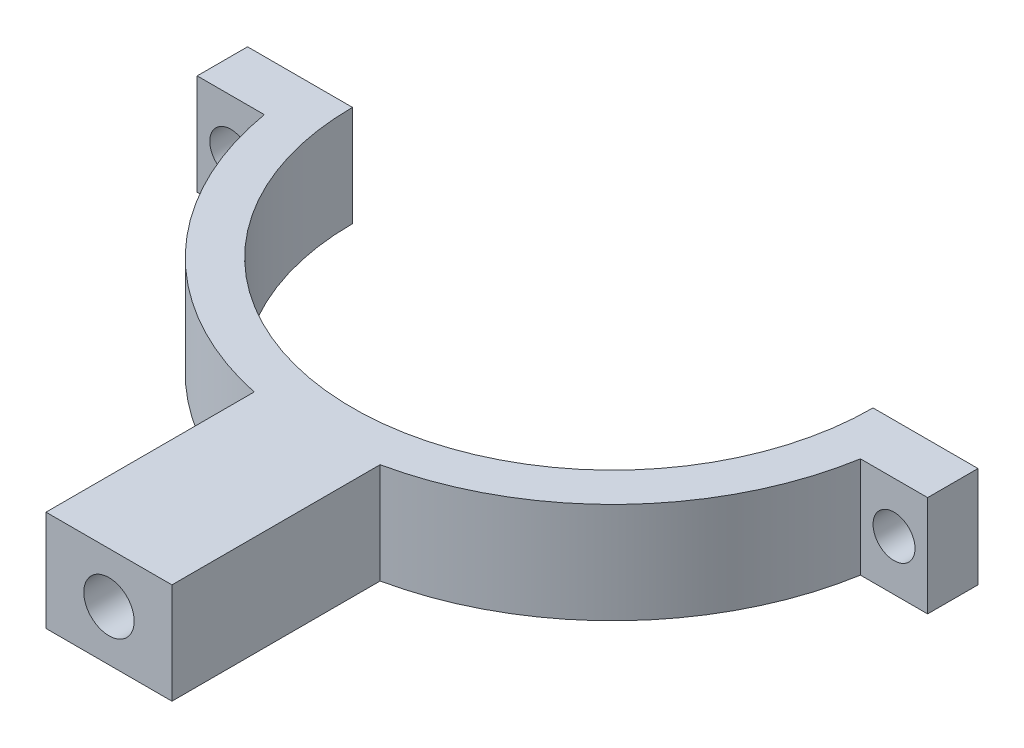
ISO-10303-21;
HEADER;
FILE_DESCRIPTION(('STEP AP214'),'2;1');
FILE_NAME('part.step','',(''),(''),'','','');
FILE_SCHEMA(('AUTOMOTIVE_DESIGN { 1 0 10303 214 1 1 1 1 }'));
ENDSEC;
DATA;
#1=APPLICATION_CONTEXT('core data for automotive mechanical design processes');
#2=APPLICATION_PROTOCOL_DEFINITION('international standard','automotive_design',2000,#1);
#3=PRODUCT_CONTEXT('',#1,'mechanical');
#4=PRODUCT('Part','Part','',(#3));
#5=PRODUCT_RELATED_PRODUCT_CATEGORY('part','',(#4));
#6=PRODUCT_DEFINITION_FORMATION('','',#4);
#7=PRODUCT_DEFINITION_CONTEXT('part definition',#1,'design');
#8=PRODUCT_DEFINITION('design','',#6,#7);
#9=PRODUCT_DEFINITION_SHAPE('','',#8);
#10=(LENGTH_UNIT() NAMED_UNIT(*) SI_UNIT(.MILLI.,.METRE.));
#11=(NAMED_UNIT(*) PLANE_ANGLE_UNIT() SI_UNIT($,.RADIAN.));
#12=(NAMED_UNIT(*) SI_UNIT($,.STERADIAN.) SOLID_ANGLE_UNIT());
#13=UNCERTAINTY_MEASURE_WITH_UNIT(LENGTH_MEASURE(1.E-05),#10,'distance_accuracy_value','');
#14=(GEOMETRIC_REPRESENTATION_CONTEXT(3) GLOBAL_UNCERTAINTY_ASSIGNED_CONTEXT((#13)) GLOBAL_UNIT_ASSIGNED_CONTEXT((#10,
#11,#12)) REPRESENTATION_CONTEXT('',''));
#15=CARTESIAN_POINT('',(0.,0.,0.));
#16=DIRECTION('',(0.,0.,1.));
#17=DIRECTION('',(1.,0.,0.));
#18=AXIS2_PLACEMENT_3D('',#15,#16,#17);
#19=CARTESIAN_POINT('',(0.,15.24,76.2));
#20=DIRECTION('',(0.,0.,-1.));
#21=DIRECTION('',(-1.,0.,0.));
#22=AXIS2_PLACEMENT_3D('',#19,#20,#21);
#23=PLANE('',#22);
#24=CARTESIAN_POINT('',(0.,7.62,76.2));
#25=DIRECTION('',(0.,0.,1.));
#26=DIRECTION('',(1.,0.,0.));
#27=AXIS2_PLACEMENT_3D('',#24,#25,#26);
#28=CIRCLE('',#27,3.81);
#29=CARTESIAN_POINT('',(3.81,7.62,76.2));
#30=VERTEX_POINT('',#29);
#31=EDGE_CURVE('E263',#30,#30,#28,.T.);
#32=ORIENTED_EDGE('',*,*,#31,.F.);
#33=EDGE_LOOP('',(#32));
#34=FACE_BOUND('',#33,.T.);
#35=DIRECTION('',(1.,0.,0.));
#36=VECTOR('',#35,1.);
#37=CARTESIAN_POINT('',(0.,0.,76.2));
#38=LINE('',#37,#36);
#39=CARTESIAN_POINT('',(-9.525,0.,76.2));
#40=VERTEX_POINT('',#39);
#41=CARTESIAN_POINT('',(9.525,0.,76.2));
#42=VERTEX_POINT('',#41);
#43=EDGE_CURVE('E158',#40,#42,#38,.T.);
#44=ORIENTED_EDGE('',*,*,#43,.T.);
#45=DIRECTION('',(0.,-1.,0.));
#46=VECTOR('',#45,1.);
#47=CARTESIAN_POINT('',(9.525,15.24,76.2));
#48=LINE('',#47,#46);
#49=CARTESIAN_POINT('',(9.525,15.24,76.2));
#50=VERTEX_POINT('',#49);
#51=EDGE_CURVE('E11',#50,#42,#48,.T.);
#52=ORIENTED_EDGE('',*,*,#51,.F.);
#53=DIRECTION('',(1.,0.,0.));
#54=VECTOR('',#53,1.);
#55=CARTESIAN_POINT('',(0.,15.24,76.2));
#56=LINE('',#55,#54);
#57=CARTESIAN_POINT('',(-9.525,15.24,76.2));
#58=VERTEX_POINT('',#57);
#59=EDGE_CURVE('E188',#58,#50,#56,.T.);
#60=ORIENTED_EDGE('',*,*,#59,.F.);
#61=DIRECTION('',(0.,-1.,0.));
#62=VECTOR('',#61,1.);
#63=CARTESIAN_POINT('',(-9.525,15.24,76.2));
#64=LINE('',#63,#62);
#65=EDGE_CURVE('E51',#58,#40,#64,.T.);
#66=ORIENTED_EDGE('',*,*,#65,.T.);
#67=EDGE_LOOP('',(#44,#52,#60,#66));
#68=FACE_BOUND('',#67,.T.);
#69=ADVANCED_FACE('F35',(#34,#68),#23,.F.);
#70=CARTESIAN_POINT('',(9.525,15.24,0.));
#71=DIRECTION('',(-1.,0.,0.));
#72=DIRECTION('',(0.,0.,1.));
#73=AXIS2_PLACEMENT_3D('',#70,#71,#72);
#74=PLANE('',#73);
#75=DIRECTION('',(0.,0.,-1.));
#76=VECTOR('',#75,1.);
#77=CARTESIAN_POINT('',(9.525,0.,0.));
#78=LINE('',#77,#76);
#79=CARTESIAN_POINT('',(9.525,0.,44.716806404304));
#80=VERTEX_POINT('',#79);
#81=EDGE_CURVE('E160',#42,#80,#78,.T.);
#82=ORIENTED_EDGE('',*,*,#81,.T.);
#83=DIRECTION('',(0.,-1.,0.));
#84=VECTOR('',#83,1.);
#85=CARTESIAN_POINT('',(9.525,15.24,44.716806404304));
#86=LINE('',#85,#84);
#87=CARTESIAN_POINT('',(9.525,15.24,44.716806404304));
#88=VERTEX_POINT('',#87);
#89=EDGE_CURVE('E43',#88,#80,#86,.T.);
#90=ORIENTED_EDGE('',*,*,#89,.F.);
#91=DIRECTION('',(0.,0.,-1.));
#92=VECTOR('',#91,1.);
#93=CARTESIAN_POINT('',(9.525,15.24,0.));
#94=LINE('',#93,#92);
#95=EDGE_CURVE('E103',#50,#88,#94,.T.);
#96=ORIENTED_EDGE('',*,*,#95,.F.);
#97=ORIENTED_EDGE('',*,*,#51,.T.);
#98=EDGE_LOOP('',(#82,#90,#96,#97));
#99=FACE_BOUND('',#98,.T.);
#100=ADVANCED_FACE('F256',(#99),#74,.F.);
#101=CARTESIAN_POINT('',(0.,15.24,0.));
#102=DIRECTION('',(0.,-1.,0.));
#103=DIRECTION('',(0.,0.,-1.));
#104=AXIS2_PLACEMENT_3D('',#101,#102,#103);
#105=CYLINDRICAL_SURFACE('',#104,45.72);
#106=CARTESIAN_POINT('',(0.,0.,0.));
#107=DIRECTION('',(0.,1.,0.));
#108=DIRECTION('',(0.,0.,1.));
#109=AXIS2_PLACEMENT_3D('',#106,#107,#108);
#110=CIRCLE('',#109,45.72);
#111=CARTESIAN_POINT('',(45.0805279472191,0.,7.62));
#112=VERTEX_POINT('',#111);
#113=EDGE_CURVE('E163',#80,#112,#110,.T.);
#114=ORIENTED_EDGE('',*,*,#113,.T.);
#115=DIRECTION('',(0.,-1.,0.));
#116=VECTOR('',#115,1.);
#117=CARTESIAN_POINT('',(45.0805279472191,15.24,7.62));
#118=LINE('',#117,#116);
#119=CARTESIAN_POINT('',(45.0805279472191,15.24,7.62));
#120=VERTEX_POINT('',#119);
#121=EDGE_CURVE('E203',#120,#112,#118,.T.);
#122=ORIENTED_EDGE('',*,*,#121,.F.);
#123=CARTESIAN_POINT('',(0.,15.24,0.));
#124=DIRECTION('',(0.,1.,0.));
#125=DIRECTION('',(0.,0.,1.));
#126=AXIS2_PLACEMENT_3D('',#123,#124,#125);
#127=CIRCLE('',#126,45.72);
#128=EDGE_CURVE('E210',#88,#120,#127,.T.);
#129=ORIENTED_EDGE('',*,*,#128,.F.);
#130=ORIENTED_EDGE('',*,*,#89,.T.);
#131=EDGE_LOOP('',(#114,#122,#129,#130));
#132=FACE_BOUND('',#131,.T.);
#133=ADVANCED_FACE('F208',(#132),#105,.T.);
#134=CARTESIAN_POINT('',(0.,15.24,7.62000000000001));
#135=DIRECTION('',(0.,0.,1.));
#136=DIRECTION('',(1.,0.,0.));
#137=AXIS2_PLACEMENT_3D('',#134,#135,#136);
#138=PLANE('',#137);
#139=CARTESIAN_POINT('',(50.1605279472191,7.62,7.62000000000001));
#140=DIRECTION('',(0.,0.,1.));
#141=DIRECTION('',(1.,0.,0.));
#142=AXIS2_PLACEMENT_3D('',#139,#140,#141);
#143=CIRCLE('',#142,3.175);
#144=CARTESIAN_POINT('',(53.3355279472191,7.62,7.62000000000001));
#145=VERTEX_POINT('',#144);
#146=EDGE_CURVE('E273',#145,#145,#143,.T.);
#147=ORIENTED_EDGE('',*,*,#146,.F.);
#148=EDGE_LOOP('',(#147));
#149=FACE_BOUND('',#148,.T.);
#150=DIRECTION('',(-1.,0.,0.));
#151=VECTOR('',#150,1.);
#152=CARTESIAN_POINT('',(0.,0.,7.62000000000001));
#153=LINE('',#152,#151);
#154=CARTESIAN_POINT('',(55.2405279472191,0.,7.62));
#155=VERTEX_POINT('',#154);
#156=EDGE_CURVE('E166',#155,#112,#153,.T.);
#157=ORIENTED_EDGE('',*,*,#156,.F.);
#158=DIRECTION('',(0.,-1.,0.));
#159=VECTOR('',#158,1.);
#160=CARTESIAN_POINT('',(55.2405279472191,15.24,7.62));
#161=LINE('',#160,#159);
#162=CARTESIAN_POINT('',(55.2405279472191,15.24,7.62));
#163=VERTEX_POINT('',#162);
#164=EDGE_CURVE('E201',#163,#155,#161,.T.);
#165=ORIENTED_EDGE('',*,*,#164,.F.);
#166=DIRECTION('',(-1.,0.,0.));
#167=VECTOR('',#166,1.);
#168=CARTESIAN_POINT('',(0.,15.24,7.62000000000001));
#169=LINE('',#168,#167);
#170=EDGE_CURVE('E219',#163,#120,#169,.T.);
#171=ORIENTED_EDGE('',*,*,#170,.T.);
#172=ORIENTED_EDGE('',*,*,#121,.T.);
#173=EDGE_LOOP('',(#157,#165,#171,#172));
#174=FACE_BOUND('',#173,.T.);
#175=ADVANCED_FACE('F216',(#149,#174),#138,.T.);
#176=CARTESIAN_POINT('',(55.2405279472191,15.24,0.));
#177=DIRECTION('',(1.,0.,0.));
#178=DIRECTION('',(0.,0.,-1.));
#179=AXIS2_PLACEMENT_3D('',#176,#177,#178);
#180=PLANE('',#179);
#181=DIRECTION('',(0.,0.,1.));
#182=VECTOR('',#181,1.);
#183=CARTESIAN_POINT('',(55.2405279472191,0.,0.));
#184=LINE('',#183,#182);
#185=CARTESIAN_POINT('',(55.2405279472191,0.,0.));
#186=VERTEX_POINT('',#185);
#187=EDGE_CURVE('E169',#186,#155,#184,.T.);
#188=ORIENTED_EDGE('',*,*,#187,.F.);
#189=DIRECTION('',(0.,-1.,0.));
#190=VECTOR('',#189,1.);
#191=CARTESIAN_POINT('',(55.2405279472191,15.24,0.));
#192=LINE('',#191,#190);
#193=CARTESIAN_POINT('',(55.2405279472191,15.24,0.));
#194=VERTEX_POINT('',#193);
#195=EDGE_CURVE('E199',#194,#186,#192,.T.);
#196=ORIENTED_EDGE('',*,*,#195,.F.);
#197=DIRECTION('',(0.,0.,1.));
#198=VECTOR('',#197,1.);
#199=CARTESIAN_POINT('',(55.2405279472191,15.24,0.));
#200=LINE('',#199,#198);
#201=EDGE_CURVE('E222',#194,#163,#200,.T.);
#202=ORIENTED_EDGE('',*,*,#201,.T.);
#203=ORIENTED_EDGE('',*,*,#164,.T.);
#204=EDGE_LOOP('',(#188,#196,#202,#203));
#205=FACE_BOUND('',#204,.T.);
#206=ADVANCED_FACE('F302',(#205),#180,.T.);
#207=CARTESIAN_POINT('',(0.,15.24,0.));
#208=DIRECTION('',(0.,0.,-1.));
#209=DIRECTION('',(-1.,0.,0.));
#210=AXIS2_PLACEMENT_3D('',#207,#208,#209);
#211=PLANE('',#210);
#212=CARTESIAN_POINT('',(50.1605279472191,7.62,0.));
#213=DIRECTION('',(0.,0.,1.));
#214=DIRECTION('',(1.,0.,0.));
#215=AXIS2_PLACEMENT_3D('',#212,#213,#214);
#216=CIRCLE('',#215,3.175);
#217=CARTESIAN_POINT('',(53.3355279472191,7.62,0.));
#218=VERTEX_POINT('',#217);
#219=EDGE_CURVE('E270',#218,#218,#216,.T.);
#220=ORIENTED_EDGE('',*,*,#219,.T.);
#221=EDGE_LOOP('',(#220));
#222=FACE_BOUND('',#221,.T.);
#223=DIRECTION('',(1.,0.,0.));
#224=VECTOR('',#223,1.);
#225=CARTESIAN_POINT('',(0.,0.,0.));
#226=LINE('',#225,#224);
#227=CARTESIAN_POINT('',(39.37,0.,0.));
#228=VERTEX_POINT('',#227);
#229=EDGE_CURVE('E172',#228,#186,#226,.T.);
#230=ORIENTED_EDGE('',*,*,#229,.F.);
#231=DIRECTION('',(0.,-1.,0.));
#232=VECTOR('',#231,1.);
#233=CARTESIAN_POINT('',(39.37,15.24,0.));
#234=LINE('',#233,#232);
#235=CARTESIAN_POINT('',(39.37,15.24,0.));
#236=VERTEX_POINT('',#235);
#237=EDGE_CURVE('E197',#236,#228,#234,.T.);
#238=ORIENTED_EDGE('',*,*,#237,.F.);
#239=DIRECTION('',(1.,0.,0.));
#240=VECTOR('',#239,1.);
#241=CARTESIAN_POINT('',(0.,15.24,0.));
#242=LINE('',#241,#240);
#243=EDGE_CURVE('E224',#236,#194,#242,.T.);
#244=ORIENTED_EDGE('',*,*,#243,.T.);
#245=ORIENTED_EDGE('',*,*,#195,.T.);
#246=EDGE_LOOP('',(#230,#238,#244,#245));
#247=FACE_BOUND('',#246,.T.);
#248=ADVANCED_FACE('F298',(#222,#247),#211,.T.);
#249=CARTESIAN_POINT('',(0.,15.24,0.));
#250=DIRECTION('',(0.,-1.,0.));
#251=DIRECTION('',(0.,0.,-1.));
#252=AXIS2_PLACEMENT_3D('',#249,#250,#251);
#253=CYLINDRICAL_SURFACE('',#252,39.37);
#254=CARTESIAN_POINT('',(0.,0.,0.));
#255=DIRECTION('',(0.,1.,0.));
#256=DIRECTION('',(0.,0.,1.));
#257=AXIS2_PLACEMENT_3D('',#254,#255,#256);
#258=CIRCLE('',#257,39.37);
#259=CARTESIAN_POINT('',(-39.37,0.,0.));
#260=VERTEX_POINT('',#259);
#261=EDGE_CURVE('E175',#260,#228,#258,.T.);
#262=ORIENTED_EDGE('',*,*,#261,.F.);
#263=DIRECTION('',(0.,-1.,0.));
#264=VECTOR('',#263,1.);
#265=CARTESIAN_POINT('',(-39.37,15.24,0.));
#266=LINE('',#265,#264);
#267=CARTESIAN_POINT('',(-39.37,15.24,0.));
#268=VERTEX_POINT('',#267);
#269=EDGE_CURVE('E195',#268,#260,#266,.T.);
#270=ORIENTED_EDGE('',*,*,#269,.F.);
#271=CARTESIAN_POINT('',(0.,15.24,0.));
#272=DIRECTION('',(0.,1.,0.));
#273=DIRECTION('',(0.,0.,1.));
#274=AXIS2_PLACEMENT_3D('',#271,#272,#273);
#275=CIRCLE('',#274,39.37);
#276=EDGE_CURVE('E231',#268,#236,#275,.T.);
#277=ORIENTED_EDGE('',*,*,#276,.T.);
#278=ORIENTED_EDGE('',*,*,#237,.T.);
#279=EDGE_LOOP('',(#262,#270,#277,#278));
#280=FACE_BOUND('',#279,.T.);
#281=ADVANCED_FACE('F294',(#280),#253,.F.);
#282=CARTESIAN_POINT('',(0.,15.24,0.));
#283=DIRECTION('',(0.,0.,1.));
#284=DIRECTION('',(1.,0.,0.));
#285=AXIS2_PLACEMENT_3D('',#282,#283,#284);
#286=PLANE('',#285);
#287=CARTESIAN_POINT('',(-50.1605279472191,7.62,0.));
#288=DIRECTION('',(0.,0.,1.));
#289=DIRECTION('',(1.,0.,0.));
#290=AXIS2_PLACEMENT_3D('',#287,#288,#289);
#291=CIRCLE('',#290,3.175);
#292=CARTESIAN_POINT('',(-46.9855279472191,7.62,0.));
#293=VERTEX_POINT('',#292);
#294=EDGE_CURVE('E276',#293,#293,#291,.T.);
#295=ORIENTED_EDGE('',*,*,#294,.T.);
#296=EDGE_LOOP('',(#295));
#297=FACE_BOUND('',#296,.T.);
#298=DIRECTION('',(-1.,0.,0.));
#299=VECTOR('',#298,1.);
#300=CARTESIAN_POINT('',(0.,0.,0.));
#301=LINE('',#300,#299);
#302=CARTESIAN_POINT('',(-55.2405279472191,0.,0.));
#303=VERTEX_POINT('',#302);
#304=EDGE_CURVE('E178',#260,#303,#301,.T.);
#305=ORIENTED_EDGE('',*,*,#304,.T.);
#306=DIRECTION('',(0.,-1.,0.));
#307=VECTOR('',#306,1.);
#308=CARTESIAN_POINT('',(-55.2405279472191,15.24,0.));
#309=LINE('',#308,#307);
#310=CARTESIAN_POINT('',(-55.2405279472191,15.24,0.));
#311=VERTEX_POINT('',#310);
#312=EDGE_CURVE('E192',#311,#303,#309,.T.);
#313=ORIENTED_EDGE('',*,*,#312,.F.);
#314=DIRECTION('',(-1.,0.,0.));
#315=VECTOR('',#314,1.);
#316=CARTESIAN_POINT('',(0.,15.24,0.));
#317=LINE('',#316,#315);
#318=EDGE_CURVE('E234',#268,#311,#317,.T.);
#319=ORIENTED_EDGE('',*,*,#318,.F.);
#320=ORIENTED_EDGE('',*,*,#269,.T.);
#321=EDGE_LOOP('',(#305,#313,#319,#320));
#322=FACE_BOUND('',#321,.T.);
#323=ADVANCED_FACE('F240',(#297,#322),#286,.F.);
#324=CARTESIAN_POINT('',(-55.2405279472191,15.24,0.));
#325=DIRECTION('',(1.,0.,0.));
#326=DIRECTION('',(0.,0.,-1.));
#327=AXIS2_PLACEMENT_3D('',#324,#325,#326);
#328=PLANE('',#327);
#329=DIRECTION('',(0.,0.,1.));
#330=VECTOR('',#329,1.);
#331=CARTESIAN_POINT('',(-55.2405279472191,0.,0.));
#332=LINE('',#331,#330);
#333=CARTESIAN_POINT('',(-55.2405279472191,0.,7.62));
#334=VERTEX_POINT('',#333);
#335=EDGE_CURVE('E180',#303,#334,#332,.T.);
#336=ORIENTED_EDGE('',*,*,#335,.T.);
#337=DIRECTION('',(0.,-1.,0.));
#338=VECTOR('',#337,1.);
#339=CARTESIAN_POINT('',(-55.2405279472191,15.24,7.62));
#340=LINE('',#339,#338);
#341=CARTESIAN_POINT('',(-55.2405279472191,15.24,7.62));
#342=VERTEX_POINT('',#341);
#343=EDGE_CURVE('E150',#342,#334,#340,.T.);
#344=ORIENTED_EDGE('',*,*,#343,.F.);
#345=DIRECTION('',(0.,0.,1.));
#346=VECTOR('',#345,1.);
#347=CARTESIAN_POINT('',(-55.2405279472191,15.24,0.));
#348=LINE('',#347,#346);
#349=EDGE_CURVE('E138',#311,#342,#348,.T.);
#350=ORIENTED_EDGE('',*,*,#349,.F.);
#351=ORIENTED_EDGE('',*,*,#312,.T.);
#352=EDGE_LOOP('',(#336,#344,#350,#351));
#353=FACE_BOUND('',#352,.T.);
#354=ADVANCED_FACE('F244',(#353),#328,.F.);
#355=CARTESIAN_POINT('',(0.,15.24,7.62000000000001));
#356=DIRECTION('',(0.,0.,-1.));
#357=DIRECTION('',(-1.,0.,0.));
#358=AXIS2_PLACEMENT_3D('',#355,#356,#357);
#359=PLANE('',#358);
#360=CARTESIAN_POINT('',(-50.1605279472191,7.62,7.62000000000001));
#361=DIRECTION('',(0.,0.,1.));
#362=DIRECTION('',(1.,0.,0.));
#363=AXIS2_PLACEMENT_3D('',#360,#361,#362);
#364=CIRCLE('',#363,3.175);
#365=CARTESIAN_POINT('',(-46.9855279472191,7.62,7.62000000000001));
#366=VERTEX_POINT('',#365);
#367=EDGE_CURVE('E279',#366,#366,#364,.T.);
#368=ORIENTED_EDGE('',*,*,#367,.F.);
#369=EDGE_LOOP('',(#368));
#370=FACE_BOUND('',#369,.T.);
#371=DIRECTION('',(1.,0.,0.));
#372=VECTOR('',#371,1.);
#373=CARTESIAN_POINT('',(0.,0.,7.62000000000001));
#374=LINE('',#373,#372);
#375=CARTESIAN_POINT('',(-45.0805279472191,0.,7.62));
#376=VERTEX_POINT('',#375);
#377=EDGE_CURVE('E147',#334,#376,#374,.T.);
#378=ORIENTED_EDGE('',*,*,#377,.T.);
#379=DIRECTION('',(0.,-1.,0.));
#380=VECTOR('',#379,1.);
#381=CARTESIAN_POINT('',(-45.0805279472191,15.24,7.62));
#382=LINE('',#381,#380);
#383=CARTESIAN_POINT('',(-45.0805279472191,15.24,7.62));
#384=VERTEX_POINT('',#383);
#385=EDGE_CURVE('E144',#384,#376,#382,.T.);
#386=ORIENTED_EDGE('',*,*,#385,.F.);
#387=DIRECTION('',(1.,0.,0.));
#388=VECTOR('',#387,1.);
#389=CARTESIAN_POINT('',(0.,15.24,7.62000000000001));
#390=LINE('',#389,#388);
#391=EDGE_CURVE('E131',#342,#384,#390,.T.);
#392=ORIENTED_EDGE('',*,*,#391,.F.);
#393=ORIENTED_EDGE('',*,*,#343,.T.);
#394=EDGE_LOOP('',(#378,#386,#392,#393));
#395=FACE_BOUND('',#394,.T.);
#396=ADVANCED_FACE('F145',(#370,#395),#359,.F.);
#397=CARTESIAN_POINT('',(0.,15.24,0.));
#398=DIRECTION('',(0.,-1.,0.));
#399=DIRECTION('',(0.,0.,-1.));
#400=AXIS2_PLACEMENT_3D('',#397,#398,#399);
#401=CYLINDRICAL_SURFACE('',#400,45.72);
#402=CARTESIAN_POINT('',(0.,0.,0.));
#403=DIRECTION('',(0.,1.,0.));
#404=DIRECTION('',(0.,0.,1.));
#405=AXIS2_PLACEMENT_3D('',#402,#403,#404);
#406=CIRCLE('',#405,45.72);
#407=CARTESIAN_POINT('',(-9.525,0.,44.716806404304));
#408=VERTEX_POINT('',#407);
#409=EDGE_CURVE('E183',#376,#408,#406,.T.);
#410=ORIENTED_EDGE('',*,*,#409,.T.);
#411=DIRECTION('',(0.,-1.,0.));
#412=VECTOR('',#411,1.);
#413=CARTESIAN_POINT('',(-9.525,15.24,44.716806404304));
#414=LINE('',#413,#412);
#415=CARTESIAN_POINT('',(-9.525,15.24,44.716806404304));
#416=VERTEX_POINT('',#415);
#417=EDGE_CURVE('E91',#416,#408,#414,.T.);
#418=ORIENTED_EDGE('',*,*,#417,.F.);
#419=CARTESIAN_POINT('',(0.,15.24,0.));
#420=DIRECTION('',(0.,1.,0.));
#421=DIRECTION('',(0.,0.,1.));
#422=AXIS2_PLACEMENT_3D('',#419,#420,#421);
#423=CIRCLE('',#422,45.72);
#424=EDGE_CURVE('E136',#384,#416,#423,.T.);
#425=ORIENTED_EDGE('',*,*,#424,.F.);
#426=ORIENTED_EDGE('',*,*,#385,.T.);
#427=EDGE_LOOP('',(#410,#418,#425,#426));
#428=FACE_BOUND('',#427,.T.);
#429=ADVANCED_FACE('F152',(#428),#401,.T.);
#430=CARTESIAN_POINT('',(-9.525,15.24,0.));
#431=DIRECTION('',(-1.,0.,0.));
#432=DIRECTION('',(0.,0.,1.));
#433=AXIS2_PLACEMENT_3D('',#430,#431,#432);
#434=PLANE('',#433);
#435=DIRECTION('',(0.,0.,-1.));
#436=VECTOR('',#435,1.);
#437=CARTESIAN_POINT('',(-9.525,0.,0.));
#438=LINE('',#437,#436);
#439=EDGE_CURVE('E185',#40,#408,#438,.T.);
#440=ORIENTED_EDGE('',*,*,#439,.F.);
#441=ORIENTED_EDGE('',*,*,#65,.F.);
#442=DIRECTION('',(0.,0.,-1.));
#443=VECTOR('',#442,1.);
#444=CARTESIAN_POINT('',(-9.525,15.24,0.));
#445=LINE('',#444,#443);
#446=EDGE_CURVE('E153',#58,#416,#445,.T.);
#447=ORIENTED_EDGE('',*,*,#446,.T.);
#448=ORIENTED_EDGE('',*,*,#417,.T.);
#449=EDGE_LOOP('',(#440,#441,#447,#448));
#450=FACE_BOUND('',#449,.T.);
#451=ADVANCED_FACE('F245',(#450),#434,.T.);
#452=CARTESIAN_POINT('',(0.,15.24,0.));
#453=DIRECTION('',(0.,1.,0.));
#454=DIRECTION('',(0.,0.,1.));
#455=AXIS2_PLACEMENT_3D('',#452,#453,#454);
#456=PLANE('',#455);
#457=ORIENTED_EDGE('',*,*,#59,.T.);
#458=ORIENTED_EDGE('',*,*,#95,.T.);
#459=ORIENTED_EDGE('',*,*,#128,.T.);
#460=ORIENTED_EDGE('',*,*,#170,.F.);
#461=ORIENTED_EDGE('',*,*,#201,.F.);
#462=ORIENTED_EDGE('',*,*,#243,.F.);
#463=ORIENTED_EDGE('',*,*,#276,.F.);
#464=ORIENTED_EDGE('',*,*,#318,.T.);
#465=ORIENTED_EDGE('',*,*,#349,.T.);
#466=ORIENTED_EDGE('',*,*,#391,.T.);
#467=ORIENTED_EDGE('',*,*,#424,.T.);
#468=ORIENTED_EDGE('',*,*,#446,.F.);
#469=EDGE_LOOP('',(#457,#458,#459,#460,#461,#462,#463,#464,#465,#466,#467,#468));
#470=FACE_BOUND('',#469,.T.);
#471=ADVANCED_FACE('F133',(#470),#456,.T.);
#472=CARTESIAN_POINT('',(0.,0.,0.));
#473=DIRECTION('',(0.,1.,0.));
#474=DIRECTION('',(0.,0.,1.));
#475=AXIS2_PLACEMENT_3D('',#472,#473,#474);
#476=PLANE('',#475);
#477=ORIENTED_EDGE('',*,*,#43,.F.);
#478=ORIENTED_EDGE('',*,*,#439,.T.);
#479=ORIENTED_EDGE('',*,*,#409,.F.);
#480=ORIENTED_EDGE('',*,*,#377,.F.);
#481=ORIENTED_EDGE('',*,*,#335,.F.);
#482=ORIENTED_EDGE('',*,*,#304,.F.);
#483=ORIENTED_EDGE('',*,*,#261,.T.);
#484=ORIENTED_EDGE('',*,*,#229,.T.);
#485=ORIENTED_EDGE('',*,*,#187,.T.);
#486=ORIENTED_EDGE('',*,*,#156,.T.);
#487=ORIENTED_EDGE('',*,*,#113,.F.);
#488=ORIENTED_EDGE('',*,*,#81,.F.);
#489=EDGE_LOOP('',(#477,#478,#479,#480,#481,#482,#483,#484,#485,#486,#487,#488));
#490=FACE_BOUND('',#489,.T.);
#491=ADVANCED_FACE('F212',(#490),#476,.F.);
#492=CARTESIAN_POINT('',(0.,7.62,68.58));
#493=DIRECTION('',(0.,0.,1.));
#494=DIRECTION('',(1.,0.,0.));
#495=AXIS2_PLACEMENT_3D('',#492,#493,#494);
#496=CONICAL_SURFACE('',#495,3.81,1.02974425867665);
#497=CARTESIAN_POINT('',(0.,7.62,66.290721041505));
#498=VERTEX_POINT('',#497);
#499=VERTEX_LOOP('',#498);
#500=FACE_BOUND('',#499,.T.);
#501=CARTESIAN_POINT('',(0.,7.62,68.58));
#502=DIRECTION('',(0.,0.,1.));
#503=DIRECTION('',(1.,0.,0.));
#504=AXIS2_PLACEMENT_3D('',#501,#502,#503);
#505=CIRCLE('',#504,3.81);
#506=CARTESIAN_POINT('',(3.81,7.62,68.58));
#507=VERTEX_POINT('',#506);
#508=EDGE_CURVE('E161',#507,#507,#505,.T.);
#509=ORIENTED_EDGE('',*,*,#508,.T.);
#510=EDGE_LOOP('',(#509));
#511=FACE_BOUND('',#510,.T.);
#512=ADVANCED_FACE('F368',(#500,#511),#496,.F.);
#513=CARTESIAN_POINT('',(0.,7.62,76.2));
#514=DIRECTION('',(0.,0.,1.));
#515=DIRECTION('',(1.,0.,0.));
#516=AXIS2_PLACEMENT_3D('',#513,#514,#515);
#517=CYLINDRICAL_SURFACE('',#516,3.81);
#518=ORIENTED_EDGE('',*,*,#508,.F.);
#519=EDGE_LOOP('',(#518));
#520=FACE_BOUND('',#519,.T.);
#521=ORIENTED_EDGE('',*,*,#31,.T.);
#522=EDGE_LOOP('',(#521));
#523=FACE_BOUND('',#522,.T.);
#524=ADVANCED_FACE('F381',(#520,#523),#517,.F.);
#525=CARTESIAN_POINT('',(50.1605279472191,7.62,7.62000000000001));
#526=DIRECTION('',(0.,0.,1.));
#527=DIRECTION('',(1.,0.,0.));
#528=AXIS2_PLACEMENT_3D('',#525,#526,#527);
#529=CYLINDRICAL_SURFACE('',#528,3.175);
#530=ORIENTED_EDGE('',*,*,#219,.F.);
#531=EDGE_LOOP('',(#530));
#532=FACE_BOUND('',#531,.T.);
#533=ORIENTED_EDGE('',*,*,#146,.T.);
#534=EDGE_LOOP('',(#533));
#535=FACE_BOUND('',#534,.T.);
#536=ADVANCED_FACE('F390',(#532,#535),#529,.F.);
#537=CARTESIAN_POINT('',(-50.1605279472191,7.62,7.62000000000001));
#538=DIRECTION('',(0.,0.,1.));
#539=DIRECTION('',(1.,0.,0.));
#540=AXIS2_PLACEMENT_3D('',#537,#538,#539);
#541=CYLINDRICAL_SURFACE('',#540,3.175);
#542=ORIENTED_EDGE('',*,*,#294,.F.);
#543=EDGE_LOOP('',(#542));
#544=FACE_BOUND('',#543,.T.);
#545=ORIENTED_EDGE('',*,*,#367,.T.);
#546=EDGE_LOOP('',(#545));
#547=FACE_BOUND('',#546,.T.);
#548=ADVANCED_FACE('F283',(#544,#547),#541,.F.);
#549=CLOSED_SHELL('',(#69,#100,#133,#175,#206,#248,#281,#323,#354,#396,#429,#451,#471,#491,#512,
#524,#536,#548));
#550=MANIFOLD_SOLID_BREP('B2',#549);
#551=ADVANCED_BREP_SHAPE_REPRESENTATION('',(#18,#550),#14);
#552=SHAPE_DEFINITION_REPRESENTATION(#9,#551);
ENDSEC;
END-ISO-10303-21;
